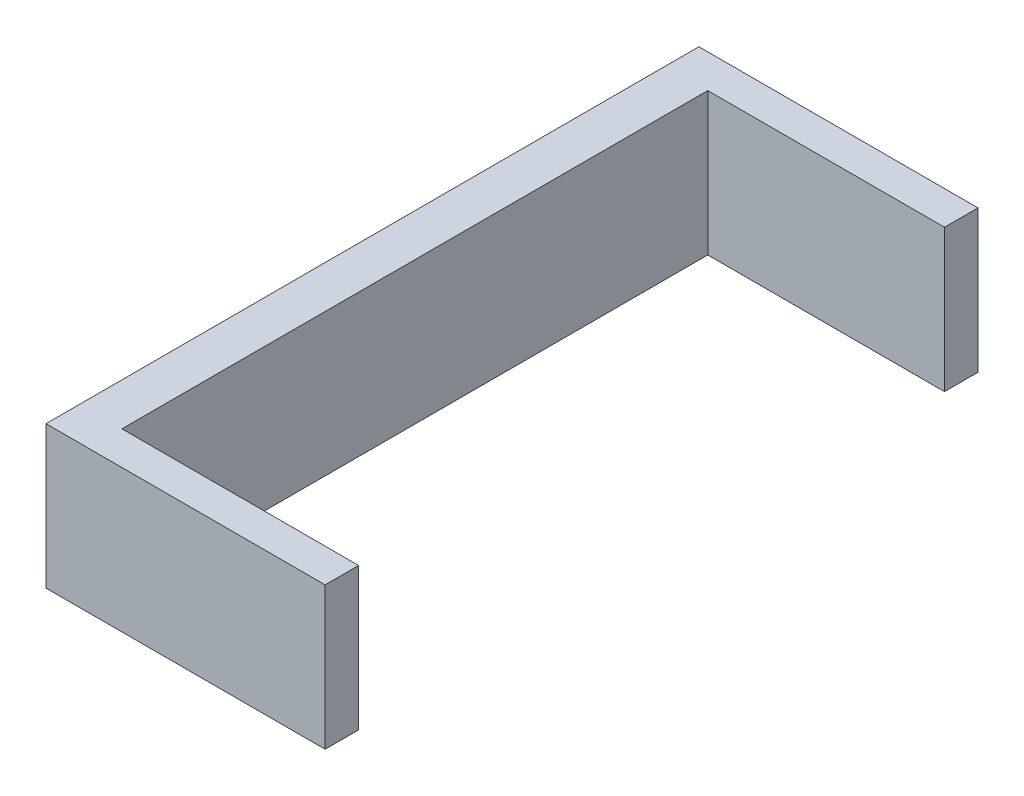
ISO-10303-21;
HEADER;
FILE_DESCRIPTION(('STEP AP214'),'2;1');
FILE_NAME('part.step','',(''),(''),'','','');
FILE_SCHEMA(('AUTOMOTIVE_DESIGN { 1 0 10303 214 1 1 1 1 }'));
ENDSEC;
DATA;
#1=APPLICATION_CONTEXT('core data for automotive mechanical design processes');
#2=APPLICATION_PROTOCOL_DEFINITION('international standard','automotive_design',2000,#1);
#3=PRODUCT_CONTEXT('',#1,'mechanical');
#4=PRODUCT('Part','Part','',(#3));
#5=PRODUCT_RELATED_PRODUCT_CATEGORY('part','',(#4));
#6=PRODUCT_DEFINITION_FORMATION('','',#4);
#7=PRODUCT_DEFINITION_CONTEXT('part definition',#1,'design');
#8=PRODUCT_DEFINITION('design','',#6,#7);
#9=PRODUCT_DEFINITION_SHAPE('','',#8);
#10=(LENGTH_UNIT() NAMED_UNIT(*) SI_UNIT(.MILLI.,.METRE.));
#11=(NAMED_UNIT(*) PLANE_ANGLE_UNIT() SI_UNIT($,.RADIAN.));
#12=(NAMED_UNIT(*) SI_UNIT($,.STERADIAN.) SOLID_ANGLE_UNIT());
#13=UNCERTAINTY_MEASURE_WITH_UNIT(LENGTH_MEASURE(1.E-05),#10,'distance_accuracy_value','');
#14=(GEOMETRIC_REPRESENTATION_CONTEXT(3) GLOBAL_UNCERTAINTY_ASSIGNED_CONTEXT((#13)) GLOBAL_UNIT_ASSIGNED_CONTEXT((#10,
#11,#12)) REPRESENTATION_CONTEXT('',''));
#15=CARTESIAN_POINT('',(0.,0.,0.));
#16=DIRECTION('',(0.,0.,1.));
#17=DIRECTION('',(1.,0.,0.));
#18=AXIS2_PLACEMENT_3D('',#15,#16,#17);
#19=CARTESIAN_POINT('',(-16.0386916690216,26.924,45.1321323709679));
#20=DIRECTION('',(1.,0.,0.));
#21=DIRECTION('',(0.,0.,-1.));
#22=AXIS2_PLACEMENT_3D('',#19,#20,#21);
#23=PLANE('',#22);
#24=DIRECTION('',(0.,0.,1.));
#25=VECTOR('',#24,1.);
#26=CARTESIAN_POINT('',(-16.0386916690216,-26.924,45.1321323709679));
#27=LINE('',#26,#25);
#28=CARTESIAN_POINT('',(-16.0386916690216,-26.924,-189.107364562651));
#29=VERTEX_POINT('',#28);
#30=CARTESIAN_POINT('',(-16.0386916690216,-26.924,57.8138885743803));
#31=VERTEX_POINT('',#30);
#32=EDGE_CURVE('E123',#29,#31,#27,.T.);
#33=ORIENTED_EDGE('',*,*,#32,.T.);
#34=DIRECTION('',(0.,-1.,0.));
#35=VECTOR('',#34,1.);
#36=CARTESIAN_POINT('',(-16.0386916690216,26.924,57.8138885743803));
#37=LINE('',#36,#35);
#38=CARTESIAN_POINT('',(-16.0386916690216,26.924,57.8138885743803));
#39=VERTEX_POINT('',#38);
#40=EDGE_CURVE('E11',#39,#31,#37,.T.);
#41=ORIENTED_EDGE('',*,*,#40,.F.);
#42=DIRECTION('',(0.,0.,1.));
#43=VECTOR('',#42,1.);
#44=CARTESIAN_POINT('',(-16.0386916690216,26.924,-65.6467379941351));
#45=LINE('',#44,#43);
#46=CARTESIAN_POINT('',(-16.0386916690216,26.924,-189.107364562651));
#47=VERTEX_POINT('',#46);
#48=EDGE_CURVE('E80',#47,#39,#45,.T.);
#49=ORIENTED_EDGE('',*,*,#48,.F.);
#50=DIRECTION('',(0.,-1.,0.));
#51=VECTOR('',#50,1.);
#52=CARTESIAN_POINT('',(-16.0386916690216,26.924,-189.107364562651));
#53=LINE('',#52,#51);
#54=EDGE_CURVE('E138',#47,#29,#53,.T.);
#55=ORIENTED_EDGE('',*,*,#54,.T.);
#56=EDGE_LOOP('',(#33,#41,#49,#55));
#57=FACE_BOUND('',#56,.T.);
#58=ADVANCED_FACE('F33',(#57),#23,.F.);
#59=CARTESIAN_POINT('',(-16.0386916690216,26.924,57.8138885743803));
#60=DIRECTION('',(0.,0.,-1.));
#61=DIRECTION('',(-1.,0.,0.));
#62=AXIS2_PLACEMENT_3D('',#59,#60,#61);
#63=PLANE('',#62);
#64=DIRECTION('',(1.,0.,0.));
#65=VECTOR('',#64,1.);
#66=CARTESIAN_POINT('',(-16.0386916690216,-26.924,57.8138885743803));
#67=LINE('',#66,#65);
#68=CARTESIAN_POINT('',(89.5182790829115,-26.924,57.8138885743803));
#69=VERTEX_POINT('',#68);
#70=EDGE_CURVE('E155',#31,#69,#67,.T.);
#71=ORIENTED_EDGE('',*,*,#70,.T.);
#72=DIRECTION('',(0.,-1.,0.));
#73=VECTOR('',#72,1.);
#74=CARTESIAN_POINT('',(89.5182790829115,26.924,57.8138885743803));
#75=LINE('',#74,#73);
#76=CARTESIAN_POINT('',(89.5182790829115,26.924,57.8138885743803));
#77=VERTEX_POINT('',#76);
#78=EDGE_CURVE('E41',#77,#69,#75,.T.);
#79=ORIENTED_EDGE('',*,*,#78,.F.);
#80=DIRECTION('',(1.,0.,0.));
#81=VECTOR('',#80,1.);
#82=CARTESIAN_POINT('',(-16.0386916690216,26.924,57.8138885743803));
#83=LINE('',#82,#81);
#84=EDGE_CURVE('E149',#39,#77,#83,.T.);
#85=ORIENTED_EDGE('',*,*,#84,.F.);
#86=ORIENTED_EDGE('',*,*,#40,.T.);
#87=EDGE_LOOP('',(#71,#79,#85,#86));
#88=FACE_BOUND('',#87,.T.);
#89=ADVANCED_FACE('F178',(#88),#63,.F.);
#90=CARTESIAN_POINT('',(89.5182790829115,26.924,45.1321323709679));
#91=DIRECTION('',(-1.,0.,0.));
#92=DIRECTION('',(0.,0.,1.));
#93=AXIS2_PLACEMENT_3D('',#90,#91,#92);
#94=PLANE('',#93);
#95=DIRECTION('',(0.,0.,-1.));
#96=VECTOR('',#95,1.);
#97=CARTESIAN_POINT('',(89.5182790829115,-26.924,45.1321323709679));
#98=LINE('',#97,#96);
#99=CARTESIAN_POINT('',(89.5182790829115,-26.924,45.1321323709679));
#100=VERTEX_POINT('',#99);
#101=EDGE_CURVE('E67',#69,#100,#98,.T.);
#102=ORIENTED_EDGE('',*,*,#101,.T.);
#103=DIRECTION('',(0.,-1.,0.));
#104=VECTOR('',#103,1.);
#105=CARTESIAN_POINT('',(89.5182790829115,26.924,45.1321323709679));
#106=LINE('',#105,#104);
#107=CARTESIAN_POINT('',(89.5182790829115,26.924,45.1321323709679));
#108=VERTEX_POINT('',#107);
#109=EDGE_CURVE('E161',#108,#100,#106,.T.);
#110=ORIENTED_EDGE('',*,*,#109,.F.);
#111=DIRECTION('',(0.,0.,-1.));
#112=VECTOR('',#111,1.);
#113=CARTESIAN_POINT('',(89.5182790829115,26.924,45.1321323709679));
#114=LINE('',#113,#112);
#115=EDGE_CURVE('E151',#77,#108,#114,.T.);
#116=ORIENTED_EDGE('',*,*,#115,.F.);
#117=ORIENTED_EDGE('',*,*,#78,.T.);
#118=EDGE_LOOP('',(#102,#110,#116,#117));
#119=FACE_BOUND('',#118,.T.);
#120=ADVANCED_FACE('F164',(#119),#94,.F.);
#121=CARTESIAN_POINT('',(0.,26.924,45.1321323709679));
#122=DIRECTION('',(0.,0.,1.));
#123=DIRECTION('',(1.,0.,0.));
#124=AXIS2_PLACEMENT_3D('',#121,#122,#123);
#125=PLANE('',#124);
#126=DIRECTION('',(-1.,0.,0.));
#127=VECTOR('',#126,1.);
#128=CARTESIAN_POINT('',(0.,-26.924,45.1321323709679));
#129=LINE('',#128,#127);
#130=CARTESIAN_POINT('',(0.,-26.924,45.1321323709679));
#131=VERTEX_POINT('',#130);
#132=EDGE_CURVE('E73',#100,#131,#129,.T.);
#133=ORIENTED_EDGE('',*,*,#132,.T.);
#134=DIRECTION('',(0.,-1.,0.));
#135=VECTOR('',#134,1.);
#136=CARTESIAN_POINT('',(0.,26.924,45.1321323709679));
#137=LINE('',#136,#135);
#138=CARTESIAN_POINT('',(0.,26.924,45.1321323709679));
#139=VERTEX_POINT('',#138);
#140=EDGE_CURVE('E113',#139,#131,#137,.T.);
#141=ORIENTED_EDGE('',*,*,#140,.F.);
#142=DIRECTION('',(-1.,0.,0.));
#143=VECTOR('',#142,1.);
#144=CARTESIAN_POINT('',(0.,26.924,45.1321323709679));
#145=LINE('',#144,#143);
#146=EDGE_CURVE('E49',#108,#139,#145,.T.);
#147=ORIENTED_EDGE('',*,*,#146,.F.);
#148=ORIENTED_EDGE('',*,*,#109,.T.);
#149=EDGE_LOOP('',(#133,#141,#147,#148));
#150=FACE_BOUND('',#149,.T.);
#151=ADVANCED_FACE('F179',(#150),#125,.F.);
#152=CARTESIAN_POINT('',(0.,26.924,-65.6467379941351));
#153=DIRECTION('',(-1.,0.,0.));
#154=DIRECTION('',(0.,0.,1.));
#155=AXIS2_PLACEMENT_3D('',#152,#153,#154);
#156=PLANE('',#155);
#157=DIRECTION('',(0.,0.,-1.));
#158=VECTOR('',#157,1.);
#159=CARTESIAN_POINT('',(0.,-26.924,-65.6467379941351));
#160=LINE('',#159,#158);
#161=CARTESIAN_POINT('',(0.,-26.924,-176.425608359238));
#162=VERTEX_POINT('',#161);
#163=EDGE_CURVE('E119',#131,#162,#160,.T.);
#164=ORIENTED_EDGE('',*,*,#163,.T.);
#165=DIRECTION('',(0.,-1.,0.));
#166=VECTOR('',#165,1.);
#167=CARTESIAN_POINT('',(0.,26.924,-176.425608359238));
#168=LINE('',#167,#166);
#169=CARTESIAN_POINT('',(0.,26.924,-176.425608359238));
#170=VERTEX_POINT('',#169);
#171=EDGE_CURVE('E116',#170,#162,#168,.T.);
#172=ORIENTED_EDGE('',*,*,#171,.F.);
#173=DIRECTION('',(0.,0.,-1.));
#174=VECTOR('',#173,1.);
#175=CARTESIAN_POINT('',(0.,26.924,-65.6467379941351));
#176=LINE('',#175,#174);
#177=EDGE_CURVE('E105',#139,#170,#176,.T.);
#178=ORIENTED_EDGE('',*,*,#177,.F.);
#179=ORIENTED_EDGE('',*,*,#140,.T.);
#180=EDGE_LOOP('',(#164,#172,#178,#179));
#181=FACE_BOUND('',#180,.T.);
#182=ADVANCED_FACE('F117',(#181),#156,.F.);
#183=CARTESIAN_POINT('',(0.,26.924,0.));
#184=DIRECTION('',(0.,1.,0.));
#185=DIRECTION('',(0.,0.,1.));
#186=AXIS2_PLACEMENT_3D('',#183,#184,#185);
#187=PLANE('',#186);
#188=ORIENTED_EDGE('',*,*,#48,.T.);
#189=ORIENTED_EDGE('',*,*,#84,.T.);
#190=ORIENTED_EDGE('',*,*,#115,.T.);
#191=ORIENTED_EDGE('',*,*,#146,.T.);
#192=ORIENTED_EDGE('',*,*,#177,.T.);
#193=DIRECTION('',(-1.,0.,0.));
#194=VECTOR('',#193,1.);
#195=CARTESIAN_POINT('',(0.,26.924,-176.425608359238));
#196=LINE('',#195,#194);
#197=CARTESIAN_POINT('',(89.5182790829115,26.924,-176.425608359238));
#198=VERTEX_POINT('',#197);
#199=EDGE_CURVE('E110',#198,#170,#196,.T.);
#200=ORIENTED_EDGE('',*,*,#199,.F.);
#201=DIRECTION('',(0.,0.,1.));
#202=VECTOR('',#201,1.);
#203=CARTESIAN_POINT('',(89.5182790829115,26.924,-176.425608359238));
#204=LINE('',#203,#202);
#205=CARTESIAN_POINT('',(89.5182790829115,26.924,-189.107364562651));
#206=VERTEX_POINT('',#205);
#207=EDGE_CURVE('E127',#206,#198,#204,.T.);
#208=ORIENTED_EDGE('',*,*,#207,.F.);
#209=DIRECTION('',(1.,0.,0.));
#210=VECTOR('',#209,1.);
#211=CARTESIAN_POINT('',(-16.0386916690216,26.924,-189.107364562651));
#212=LINE('',#211,#210);
#213=EDGE_CURVE('E130',#47,#206,#212,.T.);
#214=ORIENTED_EDGE('',*,*,#213,.F.);
#215=EDGE_LOOP('',(#188,#189,#190,#191,#192,#200,#208,#214));
#216=FACE_BOUND('',#215,.T.);
#217=ADVANCED_FACE('F107',(#216),#187,.T.);
#218=CARTESIAN_POINT('',(0.,-26.924,0.));
#219=DIRECTION('',(0.,1.,0.));
#220=DIRECTION('',(0.,0.,1.));
#221=AXIS2_PLACEMENT_3D('',#218,#219,#220);
#222=PLANE('',#221);
#223=ORIENTED_EDGE('',*,*,#32,.F.);
#224=DIRECTION('',(1.,0.,0.));
#225=VECTOR('',#224,1.);
#226=CARTESIAN_POINT('',(-16.0386916690216,-26.924,-189.107364562651));
#227=LINE('',#226,#225);
#228=CARTESIAN_POINT('',(89.5182790829115,-26.924,-189.107364562651));
#229=VERTEX_POINT('',#228);
#230=EDGE_CURVE('E128',#29,#229,#227,.T.);
#231=ORIENTED_EDGE('',*,*,#230,.T.);
#232=DIRECTION('',(0.,0.,1.));
#233=VECTOR('',#232,1.);
#234=CARTESIAN_POINT('',(89.5182790829115,-26.924,-176.425608359238));
#235=LINE('',#234,#233);
#236=CARTESIAN_POINT('',(89.5182790829115,-26.924,-176.425608359238));
#237=VERTEX_POINT('',#236);
#238=EDGE_CURVE('E133',#229,#237,#235,.T.);
#239=ORIENTED_EDGE('',*,*,#238,.T.);
#240=DIRECTION('',(-1.,0.,0.));
#241=VECTOR('',#240,1.);
#242=CARTESIAN_POINT('',(0.,-26.924,-176.425608359238));
#243=LINE('',#242,#241);
#244=EDGE_CURVE('E139',#237,#162,#243,.T.);
#245=ORIENTED_EDGE('',*,*,#244,.T.);
#246=ORIENTED_EDGE('',*,*,#163,.F.);
#247=ORIENTED_EDGE('',*,*,#132,.F.);
#248=ORIENTED_EDGE('',*,*,#101,.F.);
#249=ORIENTED_EDGE('',*,*,#70,.F.);
#250=EDGE_LOOP('',(#223,#231,#239,#245,#246,#247,#248,#249));
#251=FACE_BOUND('',#250,.T.);
#252=ADVANCED_FACE('F169',(#251),#222,.F.);
#253=CARTESIAN_POINT('',(0.,26.924,-176.425608359238));
#254=DIRECTION('',(0.,0.,1.));
#255=DIRECTION('',(1.,0.,0.));
#256=AXIS2_PLACEMENT_3D('',#253,#254,#255);
#257=PLANE('',#256);
#258=ORIENTED_EDGE('',*,*,#244,.F.);
#259=DIRECTION('',(0.,-1.,0.));
#260=VECTOR('',#259,1.);
#261=CARTESIAN_POINT('',(89.5182790829115,26.924,-176.425608359238));
#262=LINE('',#261,#260);
#263=EDGE_CURVE('E124',#198,#237,#262,.T.);
#264=ORIENTED_EDGE('',*,*,#263,.F.);
#265=ORIENTED_EDGE('',*,*,#199,.T.);
#266=ORIENTED_EDGE('',*,*,#171,.T.);
#267=EDGE_LOOP('',(#258,#264,#265,#266));
#268=FACE_BOUND('',#267,.T.);
#269=ADVANCED_FACE('F126',(#268),#257,.T.);
#270=CARTESIAN_POINT('',(89.5182790829115,26.924,-176.425608359238));
#271=DIRECTION('',(1.,0.,0.));
#272=DIRECTION('',(0.,0.,-1.));
#273=AXIS2_PLACEMENT_3D('',#270,#271,#272);
#274=PLANE('',#273);
#275=ORIENTED_EDGE('',*,*,#238,.F.);
#276=DIRECTION('',(0.,-1.,0.));
#277=VECTOR('',#276,1.);
#278=CARTESIAN_POINT('',(89.5182790829115,26.924,-189.107364562651));
#279=LINE('',#278,#277);
#280=EDGE_CURVE('E145',#206,#229,#279,.T.);
#281=ORIENTED_EDGE('',*,*,#280,.F.);
#282=ORIENTED_EDGE('',*,*,#207,.T.);
#283=ORIENTED_EDGE('',*,*,#263,.T.);
#284=EDGE_LOOP('',(#275,#281,#282,#283));
#285=FACE_BOUND('',#284,.T.);
#286=ADVANCED_FACE('F173',(#285),#274,.T.);
#287=CARTESIAN_POINT('',(-16.0386916690216,26.924,-189.107364562651));
#288=DIRECTION('',(0.,0.,-1.));
#289=DIRECTION('',(-1.,0.,0.));
#290=AXIS2_PLACEMENT_3D('',#287,#288,#289);
#291=PLANE('',#290);
#292=ORIENTED_EDGE('',*,*,#230,.F.);
#293=ORIENTED_EDGE('',*,*,#54,.F.);
#294=ORIENTED_EDGE('',*,*,#213,.T.);
#295=ORIENTED_EDGE('',*,*,#280,.T.);
#296=EDGE_LOOP('',(#292,#293,#294,#295));
#297=FACE_BOUND('',#296,.T.);
#298=ADVANCED_FACE('F176',(#297),#291,.T.);
#299=CLOSED_SHELL('',(#58,#89,#120,#151,#182,#217,#252,#269,#286,#298));
#300=MANIFOLD_SOLID_BREP('B2',#299);
#301=ADVANCED_BREP_SHAPE_REPRESENTATION('',(#18,#300),#14);
#302=SHAPE_DEFINITION_REPRESENTATION(#9,#301);
ENDSEC;
END-ISO-10303-21;
